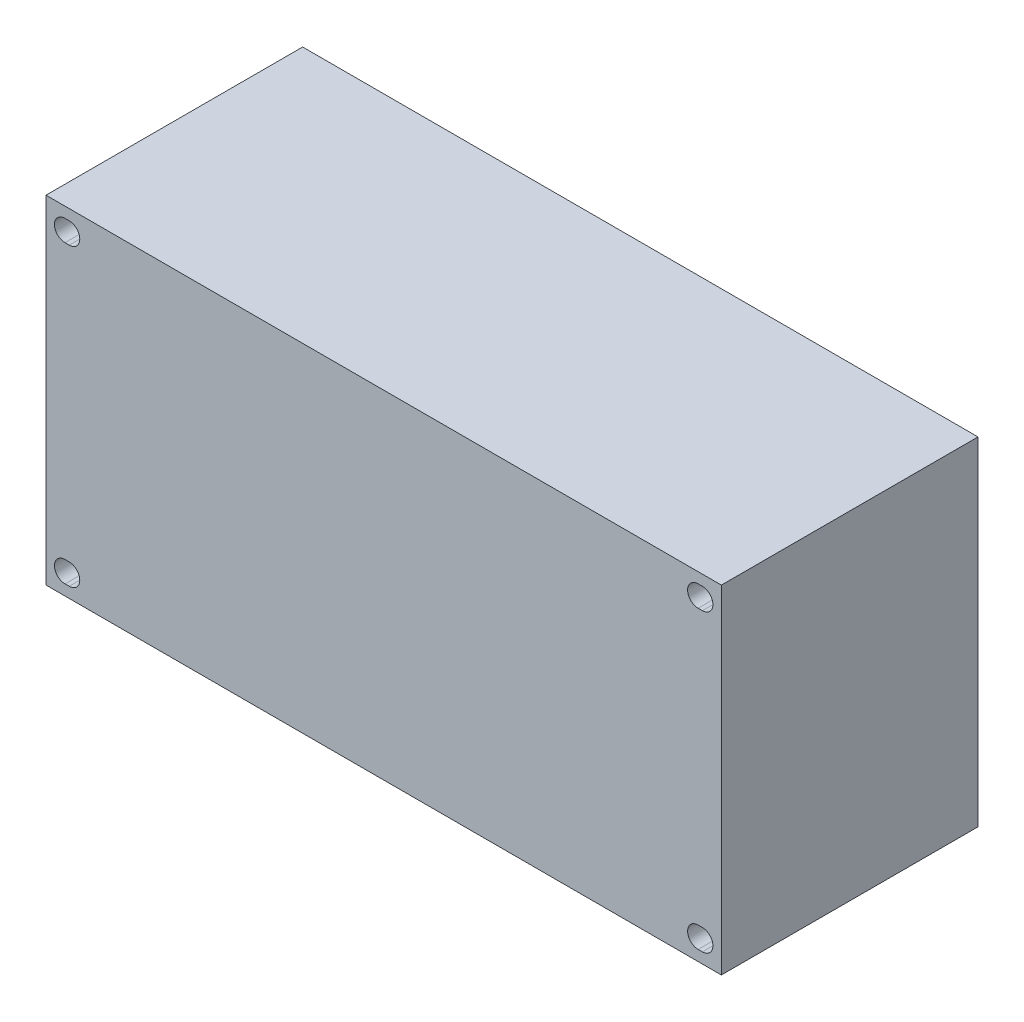
ISO-10303-21;
HEADER;
FILE_DESCRIPTION(('STEP AP214'),'2;1');
FILE_NAME('part.step','',(''),(''),'','','');
FILE_SCHEMA(('AUTOMOTIVE_DESIGN { 1 0 10303 214 1 1 1 1 }'));
ENDSEC;
DATA;
#1=APPLICATION_CONTEXT('core data for automotive mechanical design processes');
#2=APPLICATION_PROTOCOL_DEFINITION('international standard','automotive_design',2000,#1);
#3=PRODUCT_CONTEXT('',#1,'mechanical');
#4=PRODUCT('Part','Part','',(#3));
#5=PRODUCT_RELATED_PRODUCT_CATEGORY('part','',(#4));
#6=PRODUCT_DEFINITION_FORMATION('','',#4);
#7=PRODUCT_DEFINITION_CONTEXT('part definition',#1,'design');
#8=PRODUCT_DEFINITION('design','',#6,#7);
#9=PRODUCT_DEFINITION_SHAPE('','',#8);
#10=(LENGTH_UNIT() NAMED_UNIT(*) SI_UNIT(.MILLI.,.METRE.));
#11=(NAMED_UNIT(*) PLANE_ANGLE_UNIT() SI_UNIT($,.RADIAN.));
#12=(NAMED_UNIT(*) SI_UNIT($,.STERADIAN.) SOLID_ANGLE_UNIT());
#13=UNCERTAINTY_MEASURE_WITH_UNIT(LENGTH_MEASURE(1.E-05),#10,'distance_accuracy_value','');
#14=(GEOMETRIC_REPRESENTATION_CONTEXT(3) GLOBAL_UNCERTAINTY_ASSIGNED_CONTEXT((#13)) GLOBAL_UNIT_ASSIGNED_CONTEXT((#10,
#11,#12)) REPRESENTATION_CONTEXT('',''));
#15=CARTESIAN_POINT('',(0.,0.,0.));
#16=DIRECTION('',(0.,0.,1.));
#17=DIRECTION('',(1.,0.,0.));
#18=AXIS2_PLACEMENT_3D('',#15,#16,#17);
#19=CARTESIAN_POINT('',(0.,0.,38.608));
#20=DIRECTION('',(0.,0.,-1.));
#21=DIRECTION('',(-1.,0.,0.));
#22=AXIS2_PLACEMENT_3D('',#19,#20,#21);
#23=PLANE('',#22);
#24=CARTESIAN_POINT('',(47.3075,-22.225,38.608));
#25=DIRECTION('',(0.,0.,-1.));
#26=DIRECTION('',(1.,0.,0.));
#27=AXIS2_PLACEMENT_3D('',#24,#25,#26);
#28=CIRCLE('',#27,1.5875);
#29=CARTESIAN_POINT('',(47.3075,-23.8125,38.608));
#30=VERTEX_POINT('',#29);
#31=CARTESIAN_POINT('',(47.3075,-20.6375,38.608));
#32=VERTEX_POINT('',#31);
#33=EDGE_CURVE('E237',#30,#32,#28,.T.);
#34=ORIENTED_EDGE('',*,*,#33,.T.);
#35=DIRECTION('',(1.,0.,0.));
#36=VECTOR('',#35,1.);
#37=CARTESIAN_POINT('',(47.3075,-20.6375,38.608));
#38=LINE('',#37,#36);
#39=CARTESIAN_POINT('',(47.9425,-20.6375,38.608));
#40=VERTEX_POINT('',#39);
#41=EDGE_CURVE('E247',#32,#40,#38,.T.);
#42=ORIENTED_EDGE('',*,*,#41,.T.);
#43=CARTESIAN_POINT('',(47.9425,-22.225,38.608));
#44=DIRECTION('',(0.,0.,-1.));
#45=DIRECTION('',(1.,0.,0.));
#46=AXIS2_PLACEMENT_3D('',#43,#44,#45);
#47=CIRCLE('',#46,1.5875);
#48=CARTESIAN_POINT('',(47.9425,-23.8125,38.608));
#49=VERTEX_POINT('',#48);
#50=EDGE_CURVE('E260',#40,#49,#47,.T.);
#51=ORIENTED_EDGE('',*,*,#50,.T.);
#52=DIRECTION('',(-1.,0.,0.));
#53=VECTOR('',#52,1.);
#54=CARTESIAN_POINT('',(47.3075,-23.8125,38.608));
#55=LINE('',#54,#53);
#56=EDGE_CURVE('E257',#49,#30,#55,.T.);
#57=ORIENTED_EDGE('',*,*,#56,.T.);
#58=EDGE_LOOP('',(#34,#42,#51,#57));
#59=FACE_BOUND('',#58,.T.);
#60=DIRECTION('',(1.,0.,0.));
#61=VECTOR('',#60,1.);
#62=CARTESIAN_POINT('',(47.3075,20.6375,38.608));
#63=LINE('',#62,#61);
#64=CARTESIAN_POINT('',(47.3075,20.6375,38.608));
#65=VERTEX_POINT('',#64);
#66=CARTESIAN_POINT('',(47.9425,20.6375,38.608));
#67=VERTEX_POINT('',#66);
#68=EDGE_CURVE('E290',#65,#67,#63,.T.);
#69=ORIENTED_EDGE('',*,*,#68,.F.);
#70=CARTESIAN_POINT('',(47.3075,22.225,38.608));
#71=DIRECTION('',(0.,0.,1.));
#72=DIRECTION('',(1.,0.,0.));
#73=AXIS2_PLACEMENT_3D('',#70,#71,#72);
#74=CIRCLE('',#73,1.5875);
#75=CARTESIAN_POINT('',(47.3075,23.8125,38.608));
#76=VERTEX_POINT('',#75);
#77=EDGE_CURVE('E268',#76,#65,#74,.T.);
#78=ORIENTED_EDGE('',*,*,#77,.F.);
#79=DIRECTION('',(-1.,0.,0.));
#80=VECTOR('',#79,1.);
#81=CARTESIAN_POINT('',(47.3075,23.8125,38.608));
#82=LINE('',#81,#80);
#83=CARTESIAN_POINT('',(47.9425,23.8125,38.608));
#84=VERTEX_POINT('',#83);
#85=EDGE_CURVE('E279',#84,#76,#82,.T.);
#86=ORIENTED_EDGE('',*,*,#85,.F.);
#87=CARTESIAN_POINT('',(47.9425,22.225,38.608));
#88=DIRECTION('',(0.,0.,1.));
#89=DIRECTION('',(1.,0.,0.));
#90=AXIS2_PLACEMENT_3D('',#87,#88,#89);
#91=CIRCLE('',#90,1.5875);
#92=EDGE_CURVE('E293',#67,#84,#91,.T.);
#93=ORIENTED_EDGE('',*,*,#92,.F.);
#94=EDGE_LOOP('',(#69,#78,#86,#93));
#95=FACE_BOUND('',#94,.T.);
#96=DIRECTION('',(0.,1.,0.));
#97=VECTOR('',#96,1.);
#98=CARTESIAN_POINT('',(50.8,-25.4,38.608));
#99=LINE('',#98,#97);
#100=CARTESIAN_POINT('',(50.8,-25.4,38.608));
#101=VERTEX_POINT('',#100);
#102=CARTESIAN_POINT('',(50.8,25.4,38.608));
#103=VERTEX_POINT('',#102);
#104=EDGE_CURVE('E307',#101,#103,#99,.T.);
#105=ORIENTED_EDGE('',*,*,#104,.T.);
#106=DIRECTION('',(-1.,0.,0.));
#107=VECTOR('',#106,1.);
#108=CARTESIAN_POINT('',(-50.8,25.4,38.608));
#109=LINE('',#108,#107);
#110=CARTESIAN_POINT('',(-50.8,25.4,38.608));
#111=VERTEX_POINT('',#110);
#112=EDGE_CURVE('E310',#103,#111,#109,.T.);
#113=ORIENTED_EDGE('',*,*,#112,.T.);
#114=DIRECTION('',(0.,-1.,0.));
#115=VECTOR('',#114,1.);
#116=CARTESIAN_POINT('',(-50.8,-25.4,38.608));
#117=LINE('',#116,#115);
#118=CARTESIAN_POINT('',(-50.8,-25.4,38.608));
#119=VERTEX_POINT('',#118);
#120=EDGE_CURVE('E313',#111,#119,#117,.T.);
#121=ORIENTED_EDGE('',*,*,#120,.T.);
#122=DIRECTION('',(1.,0.,0.));
#123=VECTOR('',#122,1.);
#124=CARTESIAN_POINT('',(-50.8,-25.4,38.608));
#125=LINE('',#124,#123);
#126=EDGE_CURVE('E315',#119,#101,#125,.T.);
#127=ORIENTED_EDGE('',*,*,#126,.T.);
#128=EDGE_LOOP('',(#105,#113,#121,#127));
#129=FACE_BOUND('',#128,.T.);
#130=DIRECTION('',(-1.,0.,0.));
#131=VECTOR('',#130,1.);
#132=CARTESIAN_POINT('',(-47.3075,-20.6375,38.608));
#133=LINE('',#132,#131);
#134=CARTESIAN_POINT('',(-47.3075,-20.6375,38.608));
#135=VERTEX_POINT('',#134);
#136=CARTESIAN_POINT('',(-47.9425,-20.6375,38.608));
#137=VERTEX_POINT('',#136);
#138=EDGE_CURVE('E227',#135,#137,#133,.T.);
#139=ORIENTED_EDGE('',*,*,#138,.F.);
#140=CARTESIAN_POINT('',(-47.3075,-22.225,38.608));
#141=DIRECTION('',(0.,0.,1.));
#142=DIRECTION('',(-1.,0.,0.));
#143=AXIS2_PLACEMENT_3D('',#140,#141,#142);
#144=CIRCLE('',#143,1.5875);
#145=CARTESIAN_POINT('',(-47.3075,-23.8125,38.608));
#146=VERTEX_POINT('',#145);
#147=EDGE_CURVE('E208',#146,#135,#144,.T.);
#148=ORIENTED_EDGE('',*,*,#147,.F.);
#149=DIRECTION('',(1.,0.,0.));
#150=VECTOR('',#149,1.);
#151=CARTESIAN_POINT('',(-47.3075,-23.8125,38.608));
#152=LINE('',#151,#150);
#153=CARTESIAN_POINT('',(-47.9425,-23.8125,38.608));
#154=VERTEX_POINT('',#153);
#155=EDGE_CURVE('E216',#154,#146,#152,.T.);
#156=ORIENTED_EDGE('',*,*,#155,.F.);
#157=CARTESIAN_POINT('',(-47.9425,-22.225,38.608));
#158=DIRECTION('',(0.,0.,1.));
#159=DIRECTION('',(-1.,0.,0.));
#160=AXIS2_PLACEMENT_3D('',#157,#158,#159);
#161=CIRCLE('',#160,1.5875);
#162=EDGE_CURVE('E230',#137,#154,#161,.T.);
#163=ORIENTED_EDGE('',*,*,#162,.F.);
#164=EDGE_LOOP('',(#139,#148,#156,#163));
#165=FACE_BOUND('',#164,.T.);
#166=CARTESIAN_POINT('',(-47.3075,22.225,38.608));
#167=DIRECTION('',(0.,0.,-1.));
#168=DIRECTION('',(-1.,0.,0.));
#169=AXIS2_PLACEMENT_3D('',#166,#167,#168);
#170=CIRCLE('',#169,1.5875);
#171=CARTESIAN_POINT('',(-47.3075,23.8125,38.608));
#172=VERTEX_POINT('',#171);
#173=CARTESIAN_POINT('',(-47.3075,20.6375,38.608));
#174=VERTEX_POINT('',#173);
#175=EDGE_CURVE('E55',#172,#174,#170,.T.);
#176=ORIENTED_EDGE('',*,*,#175,.T.);
#177=DIRECTION('',(-1.,0.,0.));
#178=VECTOR('',#177,1.);
#179=CARTESIAN_POINT('',(-47.3075,20.6375,38.608));
#180=LINE('',#179,#178);
#181=CARTESIAN_POINT('',(-47.9425,20.6375,38.608));
#182=VERTEX_POINT('',#181);
#183=EDGE_CURVE('E193',#174,#182,#180,.T.);
#184=ORIENTED_EDGE('',*,*,#183,.T.);
#185=CARTESIAN_POINT('',(-47.9425,22.225,38.608));
#186=DIRECTION('',(0.,0.,-1.));
#187=DIRECTION('',(-1.,0.,0.));
#188=AXIS2_PLACEMENT_3D('',#185,#186,#187);
#189=CIRCLE('',#188,1.5875);
#190=CARTESIAN_POINT('',(-47.9425,23.8125,38.608));
#191=VERTEX_POINT('',#190);
#192=EDGE_CURVE('E196',#182,#191,#189,.T.);
#193=ORIENTED_EDGE('',*,*,#192,.T.);
#194=DIRECTION('',(1.,0.,0.));
#195=VECTOR('',#194,1.);
#196=CARTESIAN_POINT('',(-47.3075,23.8125,38.608));
#197=LINE('',#196,#195);
#198=EDGE_CURVE('E202',#191,#172,#197,.T.);
#199=ORIENTED_EDGE('',*,*,#198,.T.);
#200=EDGE_LOOP('',(#176,#184,#193,#199));
#201=FACE_BOUND('',#200,.T.);
#202=ADVANCED_FACE('F40',(#59,#95,#129,#165,#201),#23,.F.);
#203=CARTESIAN_POINT('',(0.,0.,0.));
#204=DIRECTION('',(0.,0.,-1.));
#205=DIRECTION('',(-1.,0.,0.));
#206=AXIS2_PLACEMENT_3D('',#203,#204,#205);
#207=PLANE('',#206);
#208=CARTESIAN_POINT('',(-47.3075,-22.225,0.));
#209=DIRECTION('',(0.,0.,1.));
#210=DIRECTION('',(-1.,0.,0.));
#211=AXIS2_PLACEMENT_3D('',#208,#209,#210);
#212=CIRCLE('',#211,1.5875);
#213=CARTESIAN_POINT('',(-47.3075,-23.8125,0.));
#214=VERTEX_POINT('',#213);
#215=CARTESIAN_POINT('',(-47.3075,-20.6375,0.));
#216=VERTEX_POINT('',#215);
#217=EDGE_CURVE('E212',#214,#216,#212,.T.);
#218=ORIENTED_EDGE('',*,*,#217,.T.);
#219=DIRECTION('',(-1.,0.,0.));
#220=VECTOR('',#219,1.);
#221=CARTESIAN_POINT('',(-47.3075,-20.6375,0.));
#222=LINE('',#221,#220);
#223=CARTESIAN_POINT('',(-47.9425,-20.6375,0.));
#224=VERTEX_POINT('',#223);
#225=EDGE_CURVE('E215',#216,#224,#222,.T.);
#226=ORIENTED_EDGE('',*,*,#225,.T.);
#227=CARTESIAN_POINT('',(-47.9425,-22.225,0.));
#228=DIRECTION('',(0.,0.,1.));
#229=DIRECTION('',(-1.,0.,0.));
#230=AXIS2_PLACEMENT_3D('',#227,#228,#229);
#231=CIRCLE('',#230,1.5875);
#232=CARTESIAN_POINT('',(-47.9425,-23.8125,0.));
#233=VERTEX_POINT('',#232);
#234=EDGE_CURVE('E219',#224,#233,#231,.T.);
#235=ORIENTED_EDGE('',*,*,#234,.T.);
#236=DIRECTION('',(1.,0.,0.));
#237=VECTOR('',#236,1.);
#238=CARTESIAN_POINT('',(-47.3075,-23.8125,0.));
#239=LINE('',#238,#237);
#240=EDGE_CURVE('E222',#233,#214,#239,.T.);
#241=ORIENTED_EDGE('',*,*,#240,.T.);
#242=EDGE_LOOP('',(#218,#226,#235,#241));
#243=FACE_BOUND('',#242,.T.);
#244=CARTESIAN_POINT('',(47.3075,22.225,0.));
#245=DIRECTION('',(0.,0.,1.));
#246=DIRECTION('',(1.,0.,0.));
#247=AXIS2_PLACEMENT_3D('',#244,#245,#246);
#248=CIRCLE('',#247,1.5875);
#249=CARTESIAN_POINT('',(47.3075,23.8125,0.));
#250=VERTEX_POINT('',#249);
#251=CARTESIAN_POINT('',(47.3075,20.6375,0.));
#252=VERTEX_POINT('',#251);
#253=EDGE_CURVE('E275',#250,#252,#248,.T.);
#254=ORIENTED_EDGE('',*,*,#253,.T.);
#255=DIRECTION('',(1.,0.,0.));
#256=VECTOR('',#255,1.);
#257=CARTESIAN_POINT('',(47.3075,20.6375,0.));
#258=LINE('',#257,#256);
#259=CARTESIAN_POINT('',(47.9425,20.6375,0.));
#260=VERTEX_POINT('',#259);
#261=EDGE_CURVE('E278',#252,#260,#258,.T.);
#262=ORIENTED_EDGE('',*,*,#261,.T.);
#263=CARTESIAN_POINT('',(47.9425,22.225,0.));
#264=DIRECTION('',(0.,0.,1.));
#265=DIRECTION('',(1.,0.,0.));
#266=AXIS2_PLACEMENT_3D('',#263,#264,#265);
#267=CIRCLE('',#266,1.5875);
#268=CARTESIAN_POINT('',(47.9425,23.8125,0.));
#269=VERTEX_POINT('',#268);
#270=EDGE_CURVE('E282',#260,#269,#267,.T.);
#271=ORIENTED_EDGE('',*,*,#270,.T.);
#272=DIRECTION('',(-1.,0.,0.));
#273=VECTOR('',#272,1.);
#274=CARTESIAN_POINT('',(47.3075,23.8125,0.));
#275=LINE('',#274,#273);
#276=EDGE_CURVE('E285',#269,#250,#275,.T.);
#277=ORIENTED_EDGE('',*,*,#276,.T.);
#278=EDGE_LOOP('',(#254,#262,#271,#277));
#279=FACE_BOUND('',#278,.T.);
#280=DIRECTION('',(0.,1.,0.));
#281=VECTOR('',#280,1.);
#282=CARTESIAN_POINT('',(50.8,-25.4,0.));
#283=LINE('',#282,#281);
#284=CARTESIAN_POINT('',(50.8,-25.4,0.));
#285=VERTEX_POINT('',#284);
#286=CARTESIAN_POINT('',(50.8,25.4,0.));
#287=VERTEX_POINT('',#286);
#288=EDGE_CURVE('E300',#285,#287,#283,.T.);
#289=ORIENTED_EDGE('',*,*,#288,.F.);
#290=DIRECTION('',(1.,0.,0.));
#291=VECTOR('',#290,1.);
#292=CARTESIAN_POINT('',(-50.8,-25.4,0.));
#293=LINE('',#292,#291);
#294=CARTESIAN_POINT('',(-50.8,-25.4,0.));
#295=VERTEX_POINT('',#294);
#296=EDGE_CURVE('E311',#295,#285,#293,.T.);
#297=ORIENTED_EDGE('',*,*,#296,.F.);
#298=DIRECTION('',(0.,-1.,0.));
#299=VECTOR('',#298,1.);
#300=CARTESIAN_POINT('',(-50.8,-25.4,0.));
#301=LINE('',#300,#299);
#302=CARTESIAN_POINT('',(-50.8,25.4,0.));
#303=VERTEX_POINT('',#302);
#304=EDGE_CURVE('E322',#303,#295,#301,.T.);
#305=ORIENTED_EDGE('',*,*,#304,.F.);
#306=DIRECTION('',(-1.,0.,0.));
#307=VECTOR('',#306,1.);
#308=CARTESIAN_POINT('',(-50.8,25.4,0.));
#309=LINE('',#308,#307);
#310=EDGE_CURVE('E320',#287,#303,#309,.T.);
#311=ORIENTED_EDGE('',*,*,#310,.F.);
#312=EDGE_LOOP('',(#289,#297,#305,#311));
#313=FACE_BOUND('',#312,.T.);
#314=DIRECTION('',(1.,0.,0.));
#315=VECTOR('',#314,1.);
#316=CARTESIAN_POINT('',(47.3075,-20.6375,0.));
#317=LINE('',#316,#315);
#318=CARTESIAN_POINT('',(47.3075,-20.6375,0.));
#319=VERTEX_POINT('',#318);
#320=CARTESIAN_POINT('',(47.9425,-20.6375,0.));
#321=VERTEX_POINT('',#320);
#322=EDGE_CURVE('E252',#319,#321,#317,.T.);
#323=ORIENTED_EDGE('',*,*,#322,.F.);
#324=CARTESIAN_POINT('',(47.3075,-22.225,0.));
#325=DIRECTION('',(0.,0.,-1.));
#326=DIRECTION('',(1.,0.,0.));
#327=AXIS2_PLACEMENT_3D('',#324,#325,#326);
#328=CIRCLE('',#327,1.5875);
#329=CARTESIAN_POINT('',(47.3075,-23.8125,0.));
#330=VERTEX_POINT('',#329);
#331=EDGE_CURVE('E244',#330,#319,#328,.T.);
#332=ORIENTED_EDGE('',*,*,#331,.F.);
#333=DIRECTION('',(-1.,0.,0.));
#334=VECTOR('',#333,1.);
#335=CARTESIAN_POINT('',(47.3075,-23.8125,0.));
#336=LINE('',#335,#334);
#337=CARTESIAN_POINT('',(47.9425,-23.8125,0.));
#338=VERTEX_POINT('',#337);
#339=EDGE_CURVE('E246',#338,#330,#336,.T.);
#340=ORIENTED_EDGE('',*,*,#339,.F.);
#341=CARTESIAN_POINT('',(47.9425,-22.225,0.));
#342=DIRECTION('',(0.,0.,-1.));
#343=DIRECTION('',(1.,0.,0.));
#344=AXIS2_PLACEMENT_3D('',#341,#342,#343);
#345=CIRCLE('',#344,1.5875);
#346=EDGE_CURVE('E249',#321,#338,#345,.T.);
#347=ORIENTED_EDGE('',*,*,#346,.F.);
#348=EDGE_LOOP('',(#323,#332,#340,#347));
#349=FACE_BOUND('',#348,.T.);
#350=DIRECTION('',(-1.,0.,0.));
#351=VECTOR('',#350,1.);
#352=CARTESIAN_POINT('',(-47.3075,20.6375,0.));
#353=LINE('',#352,#351);
#354=CARTESIAN_POINT('',(-47.3075,20.6375,0.));
#355=VERTEX_POINT('',#354);
#356=CARTESIAN_POINT('',(-47.9425,20.6375,0.));
#357=VERTEX_POINT('',#356);
#358=EDGE_CURVE('E189',#355,#357,#353,.T.);
#359=ORIENTED_EDGE('',*,*,#358,.F.);
#360=CARTESIAN_POINT('',(-47.3075,22.225,0.));
#361=DIRECTION('',(0.,0.,-1.));
#362=DIRECTION('',(-1.,0.,0.));
#363=AXIS2_PLACEMENT_3D('',#360,#361,#362);
#364=CIRCLE('',#363,1.5875);
#365=CARTESIAN_POINT('',(-47.3075,23.8125,0.));
#366=VERTEX_POINT('',#365);
#367=EDGE_CURVE('E185',#366,#355,#364,.T.);
#368=ORIENTED_EDGE('',*,*,#367,.F.);
#369=DIRECTION('',(1.,0.,0.));
#370=VECTOR('',#369,1.);
#371=CARTESIAN_POINT('',(-47.3075,23.8125,0.));
#372=LINE('',#371,#370);
#373=CARTESIAN_POINT('',(-47.9425,23.8125,0.));
#374=VERTEX_POINT('',#373);
#375=EDGE_CURVE('E177',#374,#366,#372,.T.);
#376=ORIENTED_EDGE('',*,*,#375,.F.);
#377=CARTESIAN_POINT('',(-47.9425,22.225,0.));
#378=DIRECTION('',(0.,0.,-1.));
#379=DIRECTION('',(-1.,0.,0.));
#380=AXIS2_PLACEMENT_3D('',#377,#378,#379);
#381=CIRCLE('',#380,1.5875);
#382=EDGE_CURVE('E184',#357,#374,#381,.T.);
#383=ORIENTED_EDGE('',*,*,#382,.F.);
#384=EDGE_LOOP('',(#359,#368,#376,#383));
#385=FACE_BOUND('',#384,.T.);
#386=ADVANCED_FACE('F192',(#243,#279,#313,#349,#385),#207,.T.);
#387=CARTESIAN_POINT('',(50.8,-25.4,38.608));
#388=DIRECTION('',(-1.,0.,0.));
#389=DIRECTION('',(0.,0.,1.));
#390=AXIS2_PLACEMENT_3D('',#387,#388,#389);
#391=PLANE('',#390);
#392=ORIENTED_EDGE('',*,*,#288,.T.);
#393=DIRECTION('',(0.,0.,-1.));
#394=VECTOR('',#393,1.);
#395=CARTESIAN_POINT('',(50.8,25.4,38.608));
#396=LINE('',#395,#394);
#397=EDGE_CURVE('E11',#103,#287,#396,.T.);
#398=ORIENTED_EDGE('',*,*,#397,.F.);
#399=ORIENTED_EDGE('',*,*,#104,.F.);
#400=DIRECTION('',(0.,0.,-1.));
#401=VECTOR('',#400,1.);
#402=CARTESIAN_POINT('',(50.8,-25.4,38.608));
#403=LINE('',#402,#401);
#404=EDGE_CURVE('E317',#101,#285,#403,.T.);
#405=ORIENTED_EDGE('',*,*,#404,.T.);
#406=EDGE_LOOP('',(#392,#398,#399,#405));
#407=FACE_BOUND('',#406,.T.);
#408=ADVANCED_FACE('F42',(#407),#391,.F.);
#409=CARTESIAN_POINT('',(-50.8,25.4,38.608));
#410=DIRECTION('',(0.,-1.,0.));
#411=DIRECTION('',(0.,0.,-1.));
#412=AXIS2_PLACEMENT_3D('',#409,#410,#411);
#413=PLANE('',#412);
#414=ORIENTED_EDGE('',*,*,#310,.T.);
#415=DIRECTION('',(0.,0.,-1.));
#416=VECTOR('',#415,1.);
#417=CARTESIAN_POINT('',(-50.8,25.4,38.608));
#418=LINE('',#417,#416);
#419=EDGE_CURVE('E48',#111,#303,#418,.T.);
#420=ORIENTED_EDGE('',*,*,#419,.F.);
#421=ORIENTED_EDGE('',*,*,#112,.F.);
#422=ORIENTED_EDGE('',*,*,#397,.T.);
#423=EDGE_LOOP('',(#414,#420,#421,#422));
#424=FACE_BOUND('',#423,.T.);
#425=ADVANCED_FACE('F350',(#424),#413,.F.);
#426=CARTESIAN_POINT('',(-50.8,-25.4,38.608));
#427=DIRECTION('',(1.,0.,0.));
#428=DIRECTION('',(0.,0.,-1.));
#429=AXIS2_PLACEMENT_3D('',#426,#427,#428);
#430=PLANE('',#429);
#431=ORIENTED_EDGE('',*,*,#304,.T.);
#432=DIRECTION('',(0.,0.,-1.));
#433=VECTOR('',#432,1.);
#434=CARTESIAN_POINT('',(-50.8,-25.4,38.608));
#435=LINE('',#434,#433);
#436=EDGE_CURVE('E327',#119,#295,#435,.T.);
#437=ORIENTED_EDGE('',*,*,#436,.F.);
#438=ORIENTED_EDGE('',*,*,#120,.F.);
#439=ORIENTED_EDGE('',*,*,#419,.T.);
#440=EDGE_LOOP('',(#431,#437,#438,#439));
#441=FACE_BOUND('',#440,.T.);
#442=ADVANCED_FACE('F334',(#441),#430,.F.);
#443=CARTESIAN_POINT('',(-50.8,-25.4,38.608));
#444=DIRECTION('',(0.,1.,0.));
#445=DIRECTION('',(0.,0.,1.));
#446=AXIS2_PLACEMENT_3D('',#443,#444,#445);
#447=PLANE('',#446);
#448=ORIENTED_EDGE('',*,*,#296,.T.);
#449=ORIENTED_EDGE('',*,*,#404,.F.);
#450=ORIENTED_EDGE('',*,*,#126,.F.);
#451=ORIENTED_EDGE('',*,*,#436,.T.);
#452=EDGE_LOOP('',(#448,#449,#450,#451));
#453=FACE_BOUND('',#452,.T.);
#454=ADVANCED_FACE('F343',(#453),#447,.F.);
#455=CARTESIAN_POINT('',(47.3075,22.225,0.));
#456=DIRECTION('',(0.,0.,1.));
#457=DIRECTION('',(1.,0.,0.));
#458=AXIS2_PLACEMENT_3D('',#455,#456,#457);
#459=CYLINDRICAL_SURFACE('',#458,1.5875);
#460=ORIENTED_EDGE('',*,*,#77,.T.);
#461=DIRECTION('',(0.,0.,1.));
#462=VECTOR('',#461,1.);
#463=CARTESIAN_POINT('',(47.3075,20.6375,0.));
#464=LINE('',#463,#462);
#465=EDGE_CURVE('E288',#252,#65,#464,.T.);
#466=ORIENTED_EDGE('',*,*,#465,.F.);
#467=ORIENTED_EDGE('',*,*,#253,.F.);
#468=DIRECTION('',(0.,0.,1.));
#469=VECTOR('',#468,1.);
#470=CARTESIAN_POINT('',(47.3075,23.8125,0.));
#471=LINE('',#470,#469);
#472=EDGE_CURVE('E298',#250,#76,#471,.T.);
#473=ORIENTED_EDGE('',*,*,#472,.T.);
#474=EDGE_LOOP('',(#460,#466,#467,#473));
#475=FACE_BOUND('',#474,.T.);
#476=ADVANCED_FACE('F367',(#475),#459,.F.);
#477=CARTESIAN_POINT('',(47.3075,23.8125,0.));
#478=DIRECTION('',(0.,1.,0.));
#479=DIRECTION('',(0.,0.,1.));
#480=AXIS2_PLACEMENT_3D('',#477,#478,#479);
#481=PLANE('',#480);
#482=ORIENTED_EDGE('',*,*,#85,.T.);
#483=ORIENTED_EDGE('',*,*,#472,.F.);
#484=ORIENTED_EDGE('',*,*,#276,.F.);
#485=DIRECTION('',(0.,0.,1.));
#486=VECTOR('',#485,1.);
#487=CARTESIAN_POINT('',(47.9425,23.8125,0.));
#488=LINE('',#487,#486);
#489=EDGE_CURVE('E301',#269,#84,#488,.T.);
#490=ORIENTED_EDGE('',*,*,#489,.T.);
#491=EDGE_LOOP('',(#482,#483,#484,#490));
#492=FACE_BOUND('',#491,.T.);
#493=ADVANCED_FACE('F374',(#492),#481,.F.);
#494=CARTESIAN_POINT('',(47.9425,22.225,0.));
#495=DIRECTION('',(0.,0.,1.));
#496=DIRECTION('',(1.,0.,0.));
#497=AXIS2_PLACEMENT_3D('',#494,#495,#496);
#498=CYLINDRICAL_SURFACE('',#497,1.5875);
#499=ORIENTED_EDGE('',*,*,#92,.T.);
#500=ORIENTED_EDGE('',*,*,#489,.F.);
#501=ORIENTED_EDGE('',*,*,#270,.F.);
#502=DIRECTION('',(0.,0.,1.));
#503=VECTOR('',#502,1.);
#504=CARTESIAN_POINT('',(47.9425,20.6375,0.));
#505=LINE('',#504,#503);
#506=EDGE_CURVE('E303',#260,#67,#505,.T.);
#507=ORIENTED_EDGE('',*,*,#506,.T.);
#508=EDGE_LOOP('',(#499,#500,#501,#507));
#509=FACE_BOUND('',#508,.T.);
#510=ADVANCED_FACE('F379',(#509),#498,.F.);
#511=CARTESIAN_POINT('',(47.3075,20.6375,0.));
#512=DIRECTION('',(0.,-1.,0.));
#513=DIRECTION('',(0.,0.,-1.));
#514=AXIS2_PLACEMENT_3D('',#511,#512,#513);
#515=PLANE('',#514);
#516=ORIENTED_EDGE('',*,*,#68,.T.);
#517=ORIENTED_EDGE('',*,*,#506,.F.);
#518=ORIENTED_EDGE('',*,*,#261,.F.);
#519=ORIENTED_EDGE('',*,*,#465,.T.);
#520=EDGE_LOOP('',(#516,#517,#518,#519));
#521=FACE_BOUND('',#520,.T.);
#522=ADVANCED_FACE('F388',(#521),#515,.F.);
#523=CARTESIAN_POINT('',(47.3075,-22.225,0.));
#524=DIRECTION('',(0.,0.,1.));
#525=DIRECTION('',(1.,0.,0.));
#526=AXIS2_PLACEMENT_3D('',#523,#524,#525);
#527=CYLINDRICAL_SURFACE('',#526,1.5875);
#528=ORIENTED_EDGE('',*,*,#33,.F.);
#529=DIRECTION('',(0.,0.,1.));
#530=VECTOR('',#529,1.);
#531=CARTESIAN_POINT('',(47.3075,-23.8125,0.));
#532=LINE('',#531,#530);
#533=EDGE_CURVE('E254',#330,#30,#532,.T.);
#534=ORIENTED_EDGE('',*,*,#533,.F.);
#535=ORIENTED_EDGE('',*,*,#331,.T.);
#536=DIRECTION('',(0.,0.,1.));
#537=VECTOR('',#536,1.);
#538=CARTESIAN_POINT('',(47.3075,-20.6375,0.));
#539=LINE('',#538,#537);
#540=EDGE_CURVE('E265',#319,#32,#539,.T.);
#541=ORIENTED_EDGE('',*,*,#540,.T.);
#542=EDGE_LOOP('',(#528,#534,#535,#541));
#543=FACE_BOUND('',#542,.T.);
#544=ADVANCED_FACE('F399',(#543),#527,.F.);
#545=CARTESIAN_POINT('',(47.3075,-20.6375,0.));
#546=DIRECTION('',(0.,-1.,0.));
#547=DIRECTION('',(0.,0.,-1.));
#548=AXIS2_PLACEMENT_3D('',#545,#546,#547);
#549=PLANE('',#548);
#550=ORIENTED_EDGE('',*,*,#41,.F.);
#551=ORIENTED_EDGE('',*,*,#540,.F.);
#552=ORIENTED_EDGE('',*,*,#322,.T.);
#553=DIRECTION('',(0.,0.,1.));
#554=VECTOR('',#553,1.);
#555=CARTESIAN_POINT('',(47.9425,-20.6375,0.));
#556=LINE('',#555,#554);
#557=EDGE_CURVE('E269',#321,#40,#556,.T.);
#558=ORIENTED_EDGE('',*,*,#557,.T.);
#559=EDGE_LOOP('',(#550,#551,#552,#558));
#560=FACE_BOUND('',#559,.T.);
#561=ADVANCED_FACE('F403',(#560),#549,.T.);
#562=CARTESIAN_POINT('',(47.9425,-22.225,0.));
#563=DIRECTION('',(0.,0.,1.));
#564=DIRECTION('',(1.,0.,0.));
#565=AXIS2_PLACEMENT_3D('',#562,#563,#564);
#566=CYLINDRICAL_SURFACE('',#565,1.5875);
#567=ORIENTED_EDGE('',*,*,#50,.F.);
#568=ORIENTED_EDGE('',*,*,#557,.F.);
#569=ORIENTED_EDGE('',*,*,#346,.T.);
#570=DIRECTION('',(0.,0.,1.));
#571=VECTOR('',#570,1.);
#572=CARTESIAN_POINT('',(47.9425,-23.8125,0.));
#573=LINE('',#572,#571);
#574=EDGE_CURVE('E271',#338,#49,#573,.T.);
#575=ORIENTED_EDGE('',*,*,#574,.T.);
#576=EDGE_LOOP('',(#567,#568,#569,#575));
#577=FACE_BOUND('',#576,.T.);
#578=ADVANCED_FACE('F409',(#577),#566,.F.);
#579=CARTESIAN_POINT('',(47.3075,-23.8125,0.));
#580=DIRECTION('',(0.,1.,0.));
#581=DIRECTION('',(0.,0.,1.));
#582=AXIS2_PLACEMENT_3D('',#579,#580,#581);
#583=PLANE('',#582);
#584=ORIENTED_EDGE('',*,*,#56,.F.);
#585=ORIENTED_EDGE('',*,*,#574,.F.);
#586=ORIENTED_EDGE('',*,*,#339,.T.);
#587=ORIENTED_EDGE('',*,*,#533,.T.);
#588=EDGE_LOOP('',(#584,#585,#586,#587));
#589=FACE_BOUND('',#588,.T.);
#590=ADVANCED_FACE('F405',(#589),#583,.T.);
#591=CARTESIAN_POINT('',(-47.3075,-22.225,0.));
#592=DIRECTION('',(0.,0.,1.));
#593=DIRECTION('',(1.,0.,0.));
#594=AXIS2_PLACEMENT_3D('',#591,#592,#593);
#595=CYLINDRICAL_SURFACE('',#594,1.5875);
#596=ORIENTED_EDGE('',*,*,#147,.T.);
#597=DIRECTION('',(0.,0.,1.));
#598=VECTOR('',#597,1.);
#599=CARTESIAN_POINT('',(-47.3075,-20.6375,0.));
#600=LINE('',#599,#598);
#601=EDGE_CURVE('E225',#216,#135,#600,.T.);
#602=ORIENTED_EDGE('',*,*,#601,.F.);
#603=ORIENTED_EDGE('',*,*,#217,.F.);
#604=DIRECTION('',(0.,0.,1.));
#605=VECTOR('',#604,1.);
#606=CARTESIAN_POINT('',(-47.3075,-23.8125,0.));
#607=LINE('',#606,#605);
#608=EDGE_CURVE('E235',#214,#146,#607,.T.);
#609=ORIENTED_EDGE('',*,*,#608,.T.);
#610=EDGE_LOOP('',(#596,#602,#603,#609));
#611=FACE_BOUND('',#610,.T.);
#612=ADVANCED_FACE('F408',(#611),#595,.F.);
#613=CARTESIAN_POINT('',(-47.3075,-23.8125,0.));
#614=DIRECTION('',(0.,-1.,0.));
#615=DIRECTION('',(0.,0.,-1.));
#616=AXIS2_PLACEMENT_3D('',#613,#614,#615);
#617=PLANE('',#616);
#618=ORIENTED_EDGE('',*,*,#155,.T.);
#619=ORIENTED_EDGE('',*,*,#608,.F.);
#620=ORIENTED_EDGE('',*,*,#240,.F.);
#621=DIRECTION('',(0.,0.,1.));
#622=VECTOR('',#621,1.);
#623=CARTESIAN_POINT('',(-47.9425,-23.8125,0.));
#624=LINE('',#623,#622);
#625=EDGE_CURVE('E238',#233,#154,#624,.T.);
#626=ORIENTED_EDGE('',*,*,#625,.T.);
#627=EDGE_LOOP('',(#618,#619,#620,#626));
#628=FACE_BOUND('',#627,.T.);
#629=ADVANCED_FACE('F419',(#628),#617,.F.);
#630=CARTESIAN_POINT('',(-47.9425,-22.225,0.));
#631=DIRECTION('',(0.,0.,1.));
#632=DIRECTION('',(1.,0.,0.));
#633=AXIS2_PLACEMENT_3D('',#630,#631,#632);
#634=CYLINDRICAL_SURFACE('',#633,1.5875);
#635=ORIENTED_EDGE('',*,*,#162,.T.);
#636=ORIENTED_EDGE('',*,*,#625,.F.);
#637=ORIENTED_EDGE('',*,*,#234,.F.);
#638=DIRECTION('',(0.,0.,1.));
#639=VECTOR('',#638,1.);
#640=CARTESIAN_POINT('',(-47.9425,-20.6375,0.));
#641=LINE('',#640,#639);
#642=EDGE_CURVE('E240',#224,#137,#641,.T.);
#643=ORIENTED_EDGE('',*,*,#642,.T.);
#644=EDGE_LOOP('',(#635,#636,#637,#643));
#645=FACE_BOUND('',#644,.T.);
#646=ADVANCED_FACE('F424',(#645),#634,.F.);
#647=CARTESIAN_POINT('',(-47.3075,-20.6375,0.));
#648=DIRECTION('',(0.,1.,0.));
#649=DIRECTION('',(0.,0.,1.));
#650=AXIS2_PLACEMENT_3D('',#647,#648,#649);
#651=PLANE('',#650);
#652=ORIENTED_EDGE('',*,*,#138,.T.);
#653=ORIENTED_EDGE('',*,*,#642,.F.);
#654=ORIENTED_EDGE('',*,*,#225,.F.);
#655=ORIENTED_EDGE('',*,*,#601,.T.);
#656=EDGE_LOOP('',(#652,#653,#654,#655));
#657=FACE_BOUND('',#656,.T.);
#658=ADVANCED_FACE('F421',(#657),#651,.F.);
#659=CARTESIAN_POINT('',(-47.3075,22.225,0.));
#660=DIRECTION('',(0.,0.,1.));
#661=DIRECTION('',(1.,0.,0.));
#662=AXIS2_PLACEMENT_3D('',#659,#660,#661);
#663=CYLINDRICAL_SURFACE('',#662,1.5875);
#664=ORIENTED_EDGE('',*,*,#175,.F.);
#665=DIRECTION('',(0.,0.,1.));
#666=VECTOR('',#665,1.);
#667=CARTESIAN_POINT('',(-47.3075,23.8125,0.));
#668=LINE('',#667,#666);
#669=EDGE_CURVE('E179',#366,#172,#668,.T.);
#670=ORIENTED_EDGE('',*,*,#669,.F.);
#671=ORIENTED_EDGE('',*,*,#367,.T.);
#672=DIRECTION('',(0.,0.,1.));
#673=VECTOR('',#672,1.);
#674=CARTESIAN_POINT('',(-47.3075,20.6375,0.));
#675=LINE('',#674,#673);
#676=EDGE_CURVE('E206',#355,#174,#675,.T.);
#677=ORIENTED_EDGE('',*,*,#676,.T.);
#678=EDGE_LOOP('',(#664,#670,#671,#677));
#679=FACE_BOUND('',#678,.T.);
#680=ADVANCED_FACE('F187',(#679),#663,.F.);
#681=CARTESIAN_POINT('',(-47.3075,20.6375,0.));
#682=DIRECTION('',(0.,1.,0.));
#683=DIRECTION('',(0.,0.,1.));
#684=AXIS2_PLACEMENT_3D('',#681,#682,#683);
#685=PLANE('',#684);
#686=ORIENTED_EDGE('',*,*,#183,.F.);
#687=ORIENTED_EDGE('',*,*,#676,.F.);
#688=ORIENTED_EDGE('',*,*,#358,.T.);
#689=DIRECTION('',(0.,0.,1.));
#690=VECTOR('',#689,1.);
#691=CARTESIAN_POINT('',(-47.9425,20.6375,0.));
#692=LINE('',#691,#690);
#693=EDGE_CURVE('E209',#357,#182,#692,.T.);
#694=ORIENTED_EDGE('',*,*,#693,.T.);
#695=EDGE_LOOP('',(#686,#687,#688,#694));
#696=FACE_BOUND('',#695,.T.);
#697=ADVANCED_FACE('F434',(#696),#685,.T.);
#698=CARTESIAN_POINT('',(-47.9425,22.225,0.));
#699=DIRECTION('',(0.,0.,1.));
#700=DIRECTION('',(1.,0.,0.));
#701=AXIS2_PLACEMENT_3D('',#698,#699,#700);
#702=CYLINDRICAL_SURFACE('',#701,1.5875);
#703=ORIENTED_EDGE('',*,*,#192,.F.);
#704=ORIENTED_EDGE('',*,*,#693,.F.);
#705=ORIENTED_EDGE('',*,*,#382,.T.);
#706=DIRECTION('',(0.,0.,1.));
#707=VECTOR('',#706,1.);
#708=CARTESIAN_POINT('',(-47.9425,23.8125,0.));
#709=LINE('',#708,#707);
#710=EDGE_CURVE('E63',#374,#191,#709,.T.);
#711=ORIENTED_EDGE('',*,*,#710,.T.);
#712=EDGE_LOOP('',(#703,#704,#705,#711));
#713=FACE_BOUND('',#712,.T.);
#714=ADVANCED_FACE('F437',(#713),#702,.F.);
#715=CARTESIAN_POINT('',(-47.3075,23.8125,0.));
#716=DIRECTION('',(0.,-1.,0.));
#717=DIRECTION('',(0.,0.,-1.));
#718=AXIS2_PLACEMENT_3D('',#715,#716,#717);
#719=PLANE('',#718);
#720=ORIENTED_EDGE('',*,*,#198,.F.);
#721=ORIENTED_EDGE('',*,*,#710,.F.);
#722=ORIENTED_EDGE('',*,*,#375,.T.);
#723=ORIENTED_EDGE('',*,*,#669,.T.);
#724=EDGE_LOOP('',(#720,#721,#722,#723));
#725=FACE_BOUND('',#724,.T.);
#726=ADVANCED_FACE('F178',(#725),#719,.T.);
#727=CLOSED_SHELL('',(#202,#386,#408,#425,#442,#454,#476,#493,#510,#522,#544,#561,#578,#590,
#612,#629,#646,#658,#680,#697,#714,#726));
#728=MANIFOLD_SOLID_BREP('B2',#727);
#729=ADVANCED_BREP_SHAPE_REPRESENTATION('',(#18,#728),#14);
#730=SHAPE_DEFINITION_REPRESENTATION(#9,#729);
ENDSEC;
END-ISO-10303-21;
